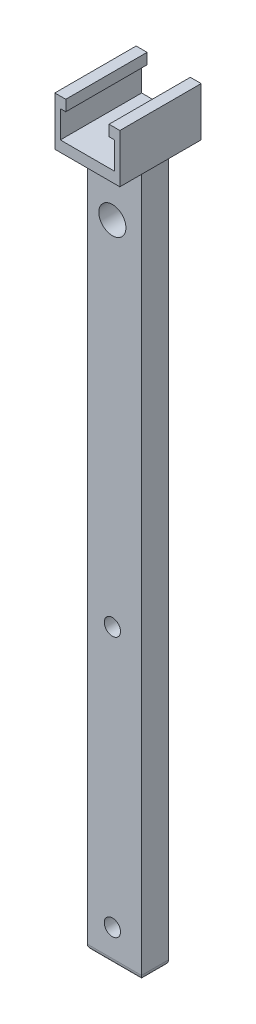
ISO-10303-21;
HEADER;
FILE_DESCRIPTION(('STEP AP214'),'2;1');
FILE_NAME('part.step','',(''),(''),'','','');
FILE_SCHEMA(('AUTOMOTIVE_DESIGN { 1 0 10303 214 1 1 1 1 }'));
ENDSEC;
DATA;
#1=APPLICATION_CONTEXT('core data for automotive mechanical design processes');
#2=APPLICATION_PROTOCOL_DEFINITION('international standard','automotive_design',2000,#1);
#3=PRODUCT_CONTEXT('',#1,'mechanical');
#4=PRODUCT('Part','Part','',(#3));
#5=PRODUCT_RELATED_PRODUCT_CATEGORY('part','',(#4));
#6=PRODUCT_DEFINITION_FORMATION('','',#4);
#7=PRODUCT_DEFINITION_CONTEXT('part definition',#1,'design');
#8=PRODUCT_DEFINITION('design','',#6,#7);
#9=PRODUCT_DEFINITION_SHAPE('','',#8);
#10=(LENGTH_UNIT() NAMED_UNIT(*) SI_UNIT(.MILLI.,.METRE.));
#11=(NAMED_UNIT(*) PLANE_ANGLE_UNIT() SI_UNIT($,.RADIAN.));
#12=(NAMED_UNIT(*) SI_UNIT($,.STERADIAN.) SOLID_ANGLE_UNIT());
#13=UNCERTAINTY_MEASURE_WITH_UNIT(LENGTH_MEASURE(1.E-05),#10,'distance_accuracy_value','');
#14=(GEOMETRIC_REPRESENTATION_CONTEXT(3) GLOBAL_UNCERTAINTY_ASSIGNED_CONTEXT((#13)) GLOBAL_UNIT_ASSIGNED_CONTEXT((#10,
#11,#12)) REPRESENTATION_CONTEXT('',''));
#15=CARTESIAN_POINT('',(0.,0.,0.));
#16=DIRECTION('',(0.,0.,1.));
#17=DIRECTION('',(1.,0.,0.));
#18=AXIS2_PLACEMENT_3D('',#15,#16,#17);
#19=CARTESIAN_POINT('',(-5.61885596488522,0.,15.));
#20=DIRECTION('',(0.,1.,0.));
#21=DIRECTION('',(0.,0.,1.));
#22=AXIS2_PLACEMENT_3D('',#19,#20,#21);
#23=PLANE('',#22);
#24=DIRECTION('',(-1.,0.,0.));
#25=VECTOR('',#24,1.);
#26=CARTESIAN_POINT('',(5.38114403511478,0.,11.));
#27=LINE('',#26,#25);
#28=CARTESIAN_POINT('',(-5.61885596488522,0.,11.));
#29=VERTEX_POINT('',#28);
#30=CARTESIAN_POINT('',(6.38114403511478,0.,11.));
#31=VERTEX_POINT('',#30);
#32=EDGE_CURVE('E207',#29,#31,#27,.F.);
#33=ORIENTED_EDGE('',*,*,#32,.T.);
#34=DIRECTION('',(0.,0.,-1.));
#35=VECTOR('',#34,1.);
#36=CARTESIAN_POINT('',(6.38114403511478,0.,15.));
#37=LINE('',#36,#35);
#38=CARTESIAN_POINT('',(6.38114403511478,0.,15.));
#39=VERTEX_POINT('',#38);
#40=EDGE_CURVE('E418',#39,#31,#37,.T.);
#41=ORIENTED_EDGE('',*,*,#40,.F.);
#42=DIRECTION('',(1.,0.,0.));
#43=VECTOR('',#42,1.);
#44=CARTESIAN_POINT('',(-5.61885596488522,0.,15.));
#45=LINE('',#44,#43);
#46=CARTESIAN_POINT('',(-5.61885596488522,0.,15.));
#47=VERTEX_POINT('',#46);
#48=EDGE_CURVE('E190',#47,#39,#45,.T.);
#49=ORIENTED_EDGE('',*,*,#48,.F.);
#50=DIRECTION('',(0.,0.,-1.));
#51=VECTOR('',#50,1.);
#52=CARTESIAN_POINT('',(-5.61885596488522,0.,15.));
#53=LINE('',#52,#51);
#54=EDGE_CURVE('E186',#47,#29,#53,.T.);
#55=ORIENTED_EDGE('',*,*,#54,.T.);
#56=EDGE_LOOP('',(#33,#41,#49,#55));
#57=FACE_BOUND('',#56,.T.);
#58=ADVANCED_FACE('F39',(#57),#23,.F.);
#59=CARTESIAN_POINT('',(6.38114403511478,0.,4.));
#60=VERTEX_POINT('',#59);
#61=CARTESIAN_POINT('',(6.38114403511478,0.,0.));
#62=VERTEX_POINT('',#61);
#63=EDGE_CURVE('E417',#60,#62,#37,.T.);
#64=ORIENTED_EDGE('',*,*,#63,.F.);
#65=DIRECTION('',(-1.,0.,0.));
#66=VECTOR('',#65,1.);
#67=CARTESIAN_POINT('',(-5.61885596488522,0.,4.));
#68=LINE('',#67,#66);
#69=CARTESIAN_POINT('',(-5.61885596488522,0.,4.));
#70=VERTEX_POINT('',#69);
#71=EDGE_CURVE('E225',#60,#70,#68,.T.);
#72=ORIENTED_EDGE('',*,*,#71,.T.);
#73=CARTESIAN_POINT('',(-5.61885596488522,0.,0.));
#74=VERTEX_POINT('',#73);
#75=EDGE_CURVE('E215',#70,#74,#53,.T.);
#76=ORIENTED_EDGE('',*,*,#75,.T.);
#77=DIRECTION('',(1.,0.,0.));
#78=VECTOR('',#77,1.);
#79=CARTESIAN_POINT('',(-5.61885596488522,0.,0.));
#80=LINE('',#79,#78);
#81=EDGE_CURVE('E354',#74,#62,#80,.T.);
#82=ORIENTED_EDGE('',*,*,#81,.T.);
#83=EDGE_LOOP('',(#64,#72,#76,#82));
#84=FACE_BOUND('',#83,.T.);
#85=ADVANCED_FACE('F437',(#84),#23,.F.);
#86=CARTESIAN_POINT('',(-3.60089189302894,9.,15.));
#87=DIRECTION('',(0.,-1.,0.));
#88=DIRECTION('',(0.,0.,-1.));
#89=AXIS2_PLACEMENT_3D('',#86,#87,#88);
#90=PLANE('',#89);
#91=DIRECTION('',(-1.,0.,0.));
#92=VECTOR('',#91,1.);
#93=CARTESIAN_POINT('',(-3.60089189302894,9.,0.));
#94=LINE('',#93,#92);
#95=CARTESIAN_POINT('',(-3.60089189302894,9.,0.));
#96=VERTEX_POINT('',#95);
#97=CARTESIAN_POINT('',(-5.61885596488522,9.,0.));
#98=VERTEX_POINT('',#97);
#99=EDGE_CURVE('E205',#96,#98,#94,.T.);
#100=ORIENTED_EDGE('',*,*,#99,.T.);
#101=DIRECTION('',(0.,0.,-1.));
#102=VECTOR('',#101,1.);
#103=CARTESIAN_POINT('',(-5.61885596488522,9.,15.));
#104=LINE('',#103,#102);
#105=CARTESIAN_POINT('',(-5.61885596488522,9.,15.));
#106=VERTEX_POINT('',#105);
#107=EDGE_CURVE('E182',#106,#98,#104,.T.);
#108=ORIENTED_EDGE('',*,*,#107,.F.);
#109=DIRECTION('',(-1.,0.,0.));
#110=VECTOR('',#109,1.);
#111=CARTESIAN_POINT('',(-3.60089189302894,9.,15.));
#112=LINE('',#111,#110);
#113=CARTESIAN_POINT('',(-3.60089189302894,9.,15.));
#114=VERTEX_POINT('',#113);
#115=EDGE_CURVE('E191',#114,#106,#112,.T.);
#116=ORIENTED_EDGE('',*,*,#115,.F.);
#117=DIRECTION('',(0.,0.,-1.));
#118=VECTOR('',#117,1.);
#119=CARTESIAN_POINT('',(-3.60089189302894,9.,15.));
#120=LINE('',#119,#118);
#121=EDGE_CURVE('E350',#114,#96,#120,.T.);
#122=ORIENTED_EDGE('',*,*,#121,.T.);
#123=EDGE_LOOP('',(#100,#108,#116,#122));
#124=FACE_BOUND('',#123,.T.);
#125=ADVANCED_FACE('F203',(#124),#90,.F.);
#126=CARTESIAN_POINT('',(-5.61885596488522,9.,15.));
#127=DIRECTION('',(1.,0.,0.));
#128=DIRECTION('',(0.,1.,0.));
#129=AXIS2_PLACEMENT_3D('',#126,#127,#128);
#130=PLANE('',#129);
#131=DIRECTION('',(0.,-1.,0.));
#132=VECTOR('',#131,1.);
#133=CARTESIAN_POINT('',(-5.61885596488522,9.,0.));
#134=LINE('',#133,#132);
#135=EDGE_CURVE('E317',#98,#74,#134,.T.);
#136=ORIENTED_EDGE('',*,*,#135,.T.);
#137=ORIENTED_EDGE('',*,*,#75,.F.);
#138=EDGE_CURVE('E213',#29,#70,#53,.T.);
#139=ORIENTED_EDGE('',*,*,#138,.F.);
#140=ORIENTED_EDGE('',*,*,#54,.F.);
#141=DIRECTION('',(0.,-1.,0.));
#142=VECTOR('',#141,1.);
#143=CARTESIAN_POINT('',(-5.61885596488522,9.,15.));
#144=LINE('',#143,#142);
#145=EDGE_CURVE('E177',#106,#47,#144,.T.);
#146=ORIENTED_EDGE('',*,*,#145,.F.);
#147=ORIENTED_EDGE('',*,*,#107,.T.);
#148=EDGE_LOOP('',(#136,#137,#139,#140,#146,#147));
#149=FACE_BOUND('',#148,.T.);
#150=ADVANCED_FACE('F180',(#149),#130,.F.);
#151=CARTESIAN_POINT('',(6.38114403511478,0.,15.));
#152=DIRECTION('',(-1.,0.,0.));
#153=DIRECTION('',(0.,0.,1.));
#154=AXIS2_PLACEMENT_3D('',#151,#152,#153);
#155=PLANE('',#154);
#156=DIRECTION('',(0.,1.,0.));
#157=VECTOR('',#156,1.);
#158=CARTESIAN_POINT('',(6.38114403511478,0.,0.));
#159=LINE('',#158,#157);
#160=CARTESIAN_POINT('',(6.38114403511478,9.,0.));
#161=VERTEX_POINT('',#160);
#162=EDGE_CURVE('E358',#62,#161,#159,.T.);
#163=ORIENTED_EDGE('',*,*,#162,.T.);
#164=DIRECTION('',(0.,0.,-1.));
#165=VECTOR('',#164,1.);
#166=CARTESIAN_POINT('',(6.38114403511478,9.,15.));
#167=LINE('',#166,#165);
#168=CARTESIAN_POINT('',(6.38114403511478,9.,15.));
#169=VERTEX_POINT('',#168);
#170=EDGE_CURVE('E414',#169,#161,#167,.T.);
#171=ORIENTED_EDGE('',*,*,#170,.F.);
#172=DIRECTION('',(0.,1.,0.));
#173=VECTOR('',#172,1.);
#174=CARTESIAN_POINT('',(6.38114403511478,0.,15.));
#175=LINE('',#174,#173);
#176=EDGE_CURVE('E325',#39,#169,#175,.T.);
#177=ORIENTED_EDGE('',*,*,#176,.F.);
#178=ORIENTED_EDGE('',*,*,#40,.T.);
#179=EDGE_CURVE('E421',#31,#60,#37,.T.);
#180=ORIENTED_EDGE('',*,*,#179,.T.);
#181=ORIENTED_EDGE('',*,*,#63,.T.);
#182=EDGE_LOOP('',(#163,#171,#177,#178,#180,#181));
#183=FACE_BOUND('',#182,.T.);
#184=ADVANCED_FACE('F431',(#183),#155,.F.);
#185=CARTESIAN_POINT('',(4.38114403511478,9.,15.));
#186=DIRECTION('',(0.,-1.,0.));
#187=DIRECTION('',(0.,0.,-1.));
#188=AXIS2_PLACEMENT_3D('',#185,#186,#187);
#189=PLANE('',#188);
#190=DIRECTION('',(-1.,0.,0.));
#191=VECTOR('',#190,1.);
#192=CARTESIAN_POINT('',(4.38114403511478,9.,0.));
#193=LINE('',#192,#191);
#194=CARTESIAN_POINT('',(4.38114403511478,9.,0.));
#195=VERTEX_POINT('',#194);
#196=EDGE_CURVE('E361',#161,#195,#193,.T.);
#197=ORIENTED_EDGE('',*,*,#196,.T.);
#198=DIRECTION('',(0.,0.,-1.));
#199=VECTOR('',#198,1.);
#200=CARTESIAN_POINT('',(4.38114403511478,9.,15.));
#201=LINE('',#200,#199);
#202=CARTESIAN_POINT('',(4.38114403511478,9.,15.));
#203=VERTEX_POINT('',#202);
#204=EDGE_CURVE('E410',#203,#195,#201,.T.);
#205=ORIENTED_EDGE('',*,*,#204,.F.);
#206=DIRECTION('',(-1.,0.,0.));
#207=VECTOR('',#206,1.);
#208=CARTESIAN_POINT('',(4.38114403511478,9.,15.));
#209=LINE('',#208,#207);
#210=EDGE_CURVE('E328',#169,#203,#209,.T.);
#211=ORIENTED_EDGE('',*,*,#210,.F.);
#212=ORIENTED_EDGE('',*,*,#170,.T.);
#213=EDGE_LOOP('',(#197,#205,#211,#212));
#214=FACE_BOUND('',#213,.T.);
#215=ADVANCED_FACE('F446',(#214),#189,.F.);
#216=CARTESIAN_POINT('',(4.38114403511478,9.,15.));
#217=DIRECTION('',(1.,0.,0.));
#218=DIRECTION('',(0.,0.,-1.));
#219=AXIS2_PLACEMENT_3D('',#216,#217,#218);
#220=PLANE('',#219);
#221=DIRECTION('',(0.,-1.,0.));
#222=VECTOR('',#221,1.);
#223=CARTESIAN_POINT('',(4.38114403511478,9.,0.));
#224=LINE('',#223,#222);
#225=CARTESIAN_POINT('',(4.38114403511478,7.,0.));
#226=VERTEX_POINT('',#225);
#227=EDGE_CURVE('E364',#195,#226,#224,.T.);
#228=ORIENTED_EDGE('',*,*,#227,.T.);
#229=DIRECTION('',(0.,0.,-1.));
#230=VECTOR('',#229,1.);
#231=CARTESIAN_POINT('',(4.38114403511478,7.,15.));
#232=LINE('',#231,#230);
#233=CARTESIAN_POINT('',(4.38114403511478,7.,15.));
#234=VERTEX_POINT('',#233);
#235=EDGE_CURVE('E406',#234,#226,#232,.T.);
#236=ORIENTED_EDGE('',*,*,#235,.F.);
#237=DIRECTION('',(0.,-1.,0.));
#238=VECTOR('',#237,1.);
#239=CARTESIAN_POINT('',(4.38114403511478,9.,15.));
#240=LINE('',#239,#238);
#241=EDGE_CURVE('E331',#203,#234,#240,.T.);
#242=ORIENTED_EDGE('',*,*,#241,.F.);
#243=ORIENTED_EDGE('',*,*,#204,.T.);
#244=EDGE_LOOP('',(#228,#236,#242,#243));
#245=FACE_BOUND('',#244,.T.);
#246=ADVANCED_FACE('F450',(#245),#220,.F.);
#247=CARTESIAN_POINT('',(4.38114403511478,7.,15.));
#248=DIRECTION('',(0.,1.,0.));
#249=DIRECTION('',(0.,0.,1.));
#250=AXIS2_PLACEMENT_3D('',#247,#248,#249);
#251=PLANE('',#250);
#252=DIRECTION('',(1.,0.,0.));
#253=VECTOR('',#252,1.);
#254=CARTESIAN_POINT('',(4.38114403511478,7.,0.));
#255=LINE('',#254,#253);
#256=CARTESIAN_POINT('',(5.39910810697106,7.,0.));
#257=VERTEX_POINT('',#256);
#258=EDGE_CURVE('E367',#226,#257,#255,.T.);
#259=ORIENTED_EDGE('',*,*,#258,.T.);
#260=DIRECTION('',(0.,0.,-1.));
#261=VECTOR('',#260,1.);
#262=CARTESIAN_POINT('',(5.39910810697106,7.,15.));
#263=LINE('',#262,#261);
#264=CARTESIAN_POINT('',(5.39910810697106,7.,15.));
#265=VERTEX_POINT('',#264);
#266=EDGE_CURVE('E402',#265,#257,#263,.T.);
#267=ORIENTED_EDGE('',*,*,#266,.F.);
#268=DIRECTION('',(1.,0.,0.));
#269=VECTOR('',#268,1.);
#270=CARTESIAN_POINT('',(4.38114403511478,7.,15.));
#271=LINE('',#270,#269);
#272=EDGE_CURVE('E334',#234,#265,#271,.T.);
#273=ORIENTED_EDGE('',*,*,#272,.F.);
#274=ORIENTED_EDGE('',*,*,#235,.T.);
#275=EDGE_LOOP('',(#259,#267,#273,#274));
#276=FACE_BOUND('',#275,.T.);
#277=ADVANCED_FACE('F497',(#276),#251,.F.);
#278=CARTESIAN_POINT('',(5.39910810697106,7.,15.));
#279=DIRECTION('',(1.,0.,0.));
#280=DIRECTION('',(0.,0.,-1.));
#281=AXIS2_PLACEMENT_3D('',#278,#279,#280);
#282=PLANE('',#281);
#283=DIRECTION('',(0.,-1.,0.));
#284=VECTOR('',#283,1.);
#285=CARTESIAN_POINT('',(5.39910810697106,7.,0.));
#286=LINE('',#285,#284);
#287=CARTESIAN_POINT('',(5.39910810697106,2.,0.));
#288=VERTEX_POINT('',#287);
#289=EDGE_CURVE('E370',#257,#288,#286,.T.);
#290=ORIENTED_EDGE('',*,*,#289,.T.);
#291=DIRECTION('',(0.,0.,-1.));
#292=VECTOR('',#291,1.);
#293=CARTESIAN_POINT('',(5.39910810697106,2.,15.));
#294=LINE('',#293,#292);
#295=CARTESIAN_POINT('',(5.39910810697106,2.,15.));
#296=VERTEX_POINT('',#295);
#297=EDGE_CURVE('E398',#296,#288,#294,.T.);
#298=ORIENTED_EDGE('',*,*,#297,.F.);
#299=DIRECTION('',(0.,-1.,0.));
#300=VECTOR('',#299,1.);
#301=CARTESIAN_POINT('',(5.39910810697106,7.,15.));
#302=LINE('',#301,#300);
#303=EDGE_CURVE('E337',#265,#296,#302,.T.);
#304=ORIENTED_EDGE('',*,*,#303,.F.);
#305=ORIENTED_EDGE('',*,*,#266,.T.);
#306=EDGE_LOOP('',(#290,#298,#304,#305));
#307=FACE_BOUND('',#306,.T.);
#308=ADVANCED_FACE('F495',(#307),#282,.F.);
#309=CARTESIAN_POINT('',(5.39910810697106,2.,15.));
#310=DIRECTION('',(0.,-1.,0.));
#311=DIRECTION('',(1.,0.,0.));
#312=AXIS2_PLACEMENT_3D('',#309,#310,#311);
#313=PLANE('',#312);
#314=DIRECTION('',(-1.,0.,0.));
#315=VECTOR('',#314,1.);
#316=CARTESIAN_POINT('',(5.39910810697106,2.,0.));
#317=LINE('',#316,#315);
#318=CARTESIAN_POINT('',(-4.60089189302894,2.,0.));
#319=VERTEX_POINT('',#318);
#320=EDGE_CURVE('E373',#288,#319,#317,.T.);
#321=ORIENTED_EDGE('',*,*,#320,.T.);
#322=DIRECTION('',(0.,0.,-1.));
#323=VECTOR('',#322,1.);
#324=CARTESIAN_POINT('',(-4.60089189302894,2.,15.));
#325=LINE('',#324,#323);
#326=CARTESIAN_POINT('',(-4.60089189302894,2.,15.));
#327=VERTEX_POINT('',#326);
#328=EDGE_CURVE('E394',#327,#319,#325,.T.);
#329=ORIENTED_EDGE('',*,*,#328,.F.);
#330=DIRECTION('',(-1.,0.,0.));
#331=VECTOR('',#330,1.);
#332=CARTESIAN_POINT('',(5.39910810697106,2.,15.));
#333=LINE('',#332,#331);
#334=EDGE_CURVE('E340',#296,#327,#333,.T.);
#335=ORIENTED_EDGE('',*,*,#334,.F.);
#336=ORIENTED_EDGE('',*,*,#297,.T.);
#337=EDGE_LOOP('',(#321,#329,#335,#336));
#338=FACE_BOUND('',#337,.T.);
#339=ADVANCED_FACE('F490',(#338),#313,.F.);
#340=CARTESIAN_POINT('',(-4.60089189302894,2.,15.));
#341=DIRECTION('',(-1.,0.,0.));
#342=DIRECTION('',(0.,-1.,0.));
#343=AXIS2_PLACEMENT_3D('',#340,#341,#342);
#344=PLANE('',#343);
#345=DIRECTION('',(0.,1.,0.));
#346=VECTOR('',#345,1.);
#347=CARTESIAN_POINT('',(-4.60089189302894,2.,0.));
#348=LINE('',#347,#346);
#349=CARTESIAN_POINT('',(-4.60089189302894,7.,0.));
#350=VERTEX_POINT('',#349);
#351=EDGE_CURVE('E376',#319,#350,#348,.T.);
#352=ORIENTED_EDGE('',*,*,#351,.T.);
#353=DIRECTION('',(0.,0.,-1.));
#354=VECTOR('',#353,1.);
#355=CARTESIAN_POINT('',(-4.60089189302894,7.,15.));
#356=LINE('',#355,#354);
#357=CARTESIAN_POINT('',(-4.60089189302894,7.,15.));
#358=VERTEX_POINT('',#357);
#359=EDGE_CURVE('E390',#358,#350,#356,.T.);
#360=ORIENTED_EDGE('',*,*,#359,.F.);
#361=DIRECTION('',(0.,1.,0.));
#362=VECTOR('',#361,1.);
#363=CARTESIAN_POINT('',(-4.60089189302894,2.,15.));
#364=LINE('',#363,#362);
#365=EDGE_CURVE('E343',#327,#358,#364,.T.);
#366=ORIENTED_EDGE('',*,*,#365,.F.);
#367=ORIENTED_EDGE('',*,*,#328,.T.);
#368=EDGE_LOOP('',(#352,#360,#366,#367));
#369=FACE_BOUND('',#368,.T.);
#370=ADVANCED_FACE('F485',(#369),#344,.F.);
#371=CARTESIAN_POINT('',(-4.60089189302894,7.,15.));
#372=DIRECTION('',(0.,1.,0.));
#373=DIRECTION('',(0.,0.,1.));
#374=AXIS2_PLACEMENT_3D('',#371,#372,#373);
#375=PLANE('',#374);
#376=DIRECTION('',(1.,0.,0.));
#377=VECTOR('',#376,1.);
#378=CARTESIAN_POINT('',(-4.60089189302894,7.,0.));
#379=LINE('',#378,#377);
#380=CARTESIAN_POINT('',(-3.60089189302894,7.,0.));
#381=VERTEX_POINT('',#380);
#382=EDGE_CURVE('E379',#350,#381,#379,.T.);
#383=ORIENTED_EDGE('',*,*,#382,.T.);
#384=DIRECTION('',(0.,0.,-1.));
#385=VECTOR('',#384,1.);
#386=CARTESIAN_POINT('',(-3.60089189302894,7.,15.));
#387=LINE('',#386,#385);
#388=CARTESIAN_POINT('',(-3.60089189302894,7.,15.));
#389=VERTEX_POINT('',#388);
#390=EDGE_CURVE('E386',#389,#381,#387,.T.);
#391=ORIENTED_EDGE('',*,*,#390,.F.);
#392=DIRECTION('',(1.,0.,0.));
#393=VECTOR('',#392,1.);
#394=CARTESIAN_POINT('',(-4.60089189302894,7.,15.));
#395=LINE('',#394,#393);
#396=EDGE_CURVE('E346',#358,#389,#395,.T.);
#397=ORIENTED_EDGE('',*,*,#396,.F.);
#398=ORIENTED_EDGE('',*,*,#359,.T.);
#399=EDGE_LOOP('',(#383,#391,#397,#398));
#400=FACE_BOUND('',#399,.T.);
#401=ADVANCED_FACE('F481',(#400),#375,.F.);
#402=CARTESIAN_POINT('',(-3.60089189302894,7.,15.));
#403=DIRECTION('',(-1.,0.,0.));
#404=DIRECTION('',(0.,0.,1.));
#405=AXIS2_PLACEMENT_3D('',#402,#403,#404);
#406=PLANE('',#405);
#407=DIRECTION('',(0.,1.,0.));
#408=VECTOR('',#407,1.);
#409=CARTESIAN_POINT('',(-3.60089189302894,7.,0.));
#410=LINE('',#409,#408);
#411=EDGE_CURVE('E201',#381,#96,#410,.T.);
#412=ORIENTED_EDGE('',*,*,#411,.T.);
#413=ORIENTED_EDGE('',*,*,#121,.F.);
#414=DIRECTION('',(0.,1.,0.));
#415=VECTOR('',#414,1.);
#416=CARTESIAN_POINT('',(-3.60089189302894,7.,15.));
#417=LINE('',#416,#415);
#418=EDGE_CURVE('E196',#389,#114,#417,.T.);
#419=ORIENTED_EDGE('',*,*,#418,.F.);
#420=ORIENTED_EDGE('',*,*,#390,.T.);
#421=EDGE_LOOP('',(#412,#413,#419,#420));
#422=FACE_BOUND('',#421,.T.);
#423=ADVANCED_FACE('F477',(#422),#406,.F.);
#424=CARTESIAN_POINT('',(0.,0.,15.));
#425=DIRECTION('',(0.,0.,1.));
#426=DIRECTION('',(1.,0.,0.));
#427=AXIS2_PLACEMENT_3D('',#424,#425,#426);
#428=PLANE('',#427);
#429=ORIENTED_EDGE('',*,*,#115,.T.);
#430=ORIENTED_EDGE('',*,*,#145,.T.);
#431=ORIENTED_EDGE('',*,*,#48,.T.);
#432=ORIENTED_EDGE('',*,*,#176,.T.);
#433=ORIENTED_EDGE('',*,*,#210,.T.);
#434=ORIENTED_EDGE('',*,*,#241,.T.);
#435=ORIENTED_EDGE('',*,*,#272,.T.);
#436=ORIENTED_EDGE('',*,*,#303,.T.);
#437=ORIENTED_EDGE('',*,*,#334,.T.);
#438=ORIENTED_EDGE('',*,*,#365,.T.);
#439=ORIENTED_EDGE('',*,*,#396,.T.);
#440=ORIENTED_EDGE('',*,*,#418,.T.);
#441=EDGE_LOOP('',(#429,#430,#431,#432,#433,#434,#435,#436,#437,#438,#439,#440));
#442=FACE_BOUND('',#441,.T.);
#443=ADVANCED_FACE('F194',(#442),#428,.T.);
#444=CARTESIAN_POINT('',(0.,0.,0.));
#445=DIRECTION('',(0.,0.,1.));
#446=DIRECTION('',(1.,0.,0.));
#447=AXIS2_PLACEMENT_3D('',#444,#445,#446);
#448=PLANE('',#447);
#449=ORIENTED_EDGE('',*,*,#99,.F.);
#450=ORIENTED_EDGE('',*,*,#411,.F.);
#451=ORIENTED_EDGE('',*,*,#382,.F.);
#452=ORIENTED_EDGE('',*,*,#351,.F.);
#453=ORIENTED_EDGE('',*,*,#320,.F.);
#454=ORIENTED_EDGE('',*,*,#289,.F.);
#455=ORIENTED_EDGE('',*,*,#258,.F.);
#456=ORIENTED_EDGE('',*,*,#227,.F.);
#457=ORIENTED_EDGE('',*,*,#196,.F.);
#458=ORIENTED_EDGE('',*,*,#162,.F.);
#459=ORIENTED_EDGE('',*,*,#81,.F.);
#460=ORIENTED_EDGE('',*,*,#135,.F.);
#461=EDGE_LOOP('',(#449,#450,#451,#452,#453,#454,#455,#456,#457,#458,#459,#460));
#462=FACE_BOUND('',#461,.T.);
#463=ADVANCED_FACE('F441',(#462),#448,.F.);
#464=CARTESIAN_POINT('',(5.38114403511478,-130.,10.));
#465=DIRECTION('',(0.,0.,-1.));
#466=DIRECTION('',(-1.,0.,0.));
#467=AXIS2_PLACEMENT_3D('',#464,#465,#466);
#468=PLANE('',#467);
#469=CARTESIAN_POINT('',(0.,-11.,10.));
#470=DIRECTION('',(0.,0.,-1.));
#471=DIRECTION('',(-1.,0.,0.));
#472=AXIS2_PLACEMENT_3D('',#469,#470,#471);
#473=CIRCLE('',#472,2.5);
#474=CARTESIAN_POINT('',(-2.5,-11.,10.));
#475=VERTEX_POINT('',#474);
#476=EDGE_CURVE('E279',#475,#475,#473,.F.);
#477=ORIENTED_EDGE('',*,*,#476,.F.);
#478=EDGE_LOOP('',(#477));
#479=FACE_BOUND('',#478,.T.);
#480=CARTESIAN_POINT('',(0.,-124.,10.));
#481=DIRECTION('',(0.,0.,-1.));
#482=DIRECTION('',(-1.,0.,0.));
#483=AXIS2_PLACEMENT_3D('',#480,#481,#482);
#484=CIRCLE('',#483,1.5);
#485=CARTESIAN_POINT('',(-1.5,-124.,10.));
#486=VERTEX_POINT('',#485);
#487=EDGE_CURVE('E732',#486,#486,#484,.F.);
#488=ORIENTED_EDGE('',*,*,#487,.F.);
#489=EDGE_LOOP('',(#488));
#490=FACE_BOUND('',#489,.T.);
#491=CARTESIAN_POINT('',(0.,-76.,10.));
#492=DIRECTION('',(0.,0.,-1.));
#493=DIRECTION('',(-1.,0.,0.));
#494=AXIS2_PLACEMENT_3D('',#491,#492,#493);
#495=CIRCLE('',#494,1.5);
#496=CARTESIAN_POINT('',(-1.5,-76.,10.));
#497=VERTEX_POINT('',#496);
#498=EDGE_CURVE('E739',#497,#497,#495,.F.);
#499=ORIENTED_EDGE('',*,*,#498,.F.);
#500=EDGE_LOOP('',(#499));
#501=FACE_BOUND('',#500,.T.);
#502=DIRECTION('',(0.,1.,0.));
#503=VECTOR('',#502,1.);
#504=CARTESIAN_POINT('',(-4.61885596488522,-130.,10.));
#505=LINE('',#504,#503);
#506=CARTESIAN_POINT('',(-4.61885596488522,-129.,10.));
#507=VERTEX_POINT('',#506);
#508=CARTESIAN_POINT('',(-4.61885596488522,-1.,10.));
#509=VERTEX_POINT('',#508);
#510=EDGE_CURVE('E308',#507,#509,#505,.T.);
#511=ORIENTED_EDGE('',*,*,#510,.F.);
#512=DIRECTION('',(-1.,0.,0.));
#513=VECTOR('',#512,1.);
#514=CARTESIAN_POINT('',(5.38114403511478,-129.,10.));
#515=LINE('',#514,#513);
#516=CARTESIAN_POINT('',(5.38114403511478,-129.,10.));
#517=VERTEX_POINT('',#516);
#518=EDGE_CURVE('E11',#507,#517,#515,.F.);
#519=ORIENTED_EDGE('',*,*,#518,.T.);
#520=DIRECTION('',(0.,1.,0.));
#521=VECTOR('',#520,1.);
#522=CARTESIAN_POINT('',(5.38114403511478,-130.,10.));
#523=LINE('',#522,#521);
#524=CARTESIAN_POINT('',(5.38114403511478,-1.,10.));
#525=VERTEX_POINT('',#524);
#526=EDGE_CURVE('E229',#517,#525,#523,.T.);
#527=ORIENTED_EDGE('',*,*,#526,.T.);
#528=DIRECTION('',(-1.,0.,0.));
#529=VECTOR('',#528,1.);
#530=CARTESIAN_POINT('',(-4.61885596488522,-1.,10.));
#531=LINE('',#530,#529);
#532=EDGE_CURVE('E221',#525,#509,#531,.T.);
#533=ORIENTED_EDGE('',*,*,#532,.T.);
#534=EDGE_LOOP('',(#511,#519,#527,#533));
#535=FACE_BOUND('',#534,.T.);
#536=ADVANCED_FACE('F310',(#479,#490,#501,#535),#468,.F.);
#537=CARTESIAN_POINT('',(-4.61885596488522,-130.,5.));
#538=DIRECTION('',(-1.,0.,0.));
#539=DIRECTION('',(0.,0.,1.));
#540=AXIS2_PLACEMENT_3D('',#537,#538,#539);
#541=PLANE('',#540);
#542=DIRECTION('',(0.,1.,0.));
#543=VECTOR('',#542,1.);
#544=CARTESIAN_POINT('',(-4.61885596488522,-130.,5.));
#545=LINE('',#544,#543);
#546=CARTESIAN_POINT('',(-4.61885596488522,-129.,5.));
#547=VERTEX_POINT('',#546);
#548=CARTESIAN_POINT('',(-4.61885596488522,-1.,5.));
#549=VERTEX_POINT('',#548);
#550=EDGE_CURVE('E309',#547,#549,#545,.T.);
#551=ORIENTED_EDGE('',*,*,#550,.F.);
#552=DIRECTION('',(0.,0.,1.));
#553=VECTOR('',#552,1.);
#554=CARTESIAN_POINT('',(-4.61885596488522,-129.,10.));
#555=LINE('',#554,#553);
#556=EDGE_CURVE('E253',#547,#507,#555,.T.);
#557=ORIENTED_EDGE('',*,*,#556,.T.);
#558=ORIENTED_EDGE('',*,*,#510,.T.);
#559=DIRECTION('',(0.,0.,1.));
#560=VECTOR('',#559,1.);
#561=CARTESIAN_POINT('',(-4.61885596488522,-1.,5.));
#562=LINE('',#561,#560);
#563=EDGE_CURVE('E211',#509,#549,#562,.F.);
#564=ORIENTED_EDGE('',*,*,#563,.T.);
#565=EDGE_LOOP('',(#551,#557,#558,#564));
#566=FACE_BOUND('',#565,.T.);
#567=ADVANCED_FACE('F307',(#566),#541,.T.);
#568=CARTESIAN_POINT('',(5.38114403511478,-130.,5.));
#569=DIRECTION('',(0.,0.,-1.));
#570=DIRECTION('',(-1.,0.,0.));
#571=AXIS2_PLACEMENT_3D('',#568,#569,#570);
#572=PLANE('',#571);
#573=CARTESIAN_POINT('',(0.,-11.,5.));
#574=DIRECTION('',(0.,0.,-1.));
#575=DIRECTION('',(-1.,0.,0.));
#576=AXIS2_PLACEMENT_3D('',#573,#574,#575);
#577=CIRCLE('',#576,2.5);
#578=CARTESIAN_POINT('',(-2.5,-11.,5.));
#579=VERTEX_POINT('',#578);
#580=EDGE_CURVE('E726',#579,#579,#577,.T.);
#581=ORIENTED_EDGE('',*,*,#580,.F.);
#582=EDGE_LOOP('',(#581));
#583=FACE_BOUND('',#582,.T.);
#584=CARTESIAN_POINT('',(0.,-124.,5.));
#585=DIRECTION('',(0.,0.,-1.));
#586=DIRECTION('',(-1.,0.,0.));
#587=AXIS2_PLACEMENT_3D('',#584,#585,#586);
#588=CIRCLE('',#587,1.5);
#589=CARTESIAN_POINT('',(-1.5,-124.,5.));
#590=VERTEX_POINT('',#589);
#591=EDGE_CURVE('E735',#590,#590,#588,.T.);
#592=ORIENTED_EDGE('',*,*,#591,.F.);
#593=EDGE_LOOP('',(#592));
#594=FACE_BOUND('',#593,.T.);
#595=CARTESIAN_POINT('',(0.,-76.,5.));
#596=DIRECTION('',(0.,0.,-1.));
#597=DIRECTION('',(-1.,0.,0.));
#598=AXIS2_PLACEMENT_3D('',#595,#596,#597);
#599=CIRCLE('',#598,1.5);
#600=CARTESIAN_POINT('',(-1.5,-76.,5.));
#601=VERTEX_POINT('',#600);
#602=EDGE_CURVE('E743',#601,#601,#599,.T.);
#603=ORIENTED_EDGE('',*,*,#602,.F.);
#604=EDGE_LOOP('',(#603));
#605=FACE_BOUND('',#604,.T.);
#606=DIRECTION('',(0.,1.,0.));
#607=VECTOR('',#606,1.);
#608=CARTESIAN_POINT('',(5.38114403511478,-130.,5.));
#609=LINE('',#608,#607);
#610=CARTESIAN_POINT('',(5.38114403511478,-129.,5.));
#611=VERTEX_POINT('',#610);
#612=CARTESIAN_POINT('',(5.38114403511478,-1.,5.));
#613=VERTEX_POINT('',#612);
#614=EDGE_CURVE('E319',#611,#613,#609,.T.);
#615=ORIENTED_EDGE('',*,*,#614,.F.);
#616=DIRECTION('',(-1.,0.,0.));
#617=VECTOR('',#616,1.);
#618=CARTESIAN_POINT('',(-4.61885596488522,-129.,5.));
#619=LINE('',#618,#617);
#620=EDGE_CURVE('E270',#611,#547,#619,.T.);
#621=ORIENTED_EDGE('',*,*,#620,.T.);
#622=ORIENTED_EDGE('',*,*,#550,.T.);
#623=DIRECTION('',(-1.,0.,0.));
#624=VECTOR('',#623,1.);
#625=CARTESIAN_POINT('',(5.38114403511478,-1.,5.));
#626=LINE('',#625,#624);
#627=EDGE_CURVE('E233',#549,#613,#626,.F.);
#628=ORIENTED_EDGE('',*,*,#627,.T.);
#629=EDGE_LOOP('',(#615,#621,#622,#628));
#630=FACE_BOUND('',#629,.T.);
#631=ADVANCED_FACE('F470',(#583,#594,#605,#630),#572,.T.);
#632=CARTESIAN_POINT('',(5.38114403511478,-130.,5.));
#633=DIRECTION('',(-1.,0.,0.));
#634=DIRECTION('',(0.,0.,1.));
#635=AXIS2_PLACEMENT_3D('',#632,#633,#634);
#636=PLANE('',#635);
#637=ORIENTED_EDGE('',*,*,#526,.F.);
#638=DIRECTION('',(0.,0.,1.));
#639=VECTOR('',#638,1.);
#640=CARTESIAN_POINT('',(5.38114403511478,-129.,5.));
#641=LINE('',#640,#639);
#642=EDGE_CURVE('E49',#517,#611,#641,.F.);
#643=ORIENTED_EDGE('',*,*,#642,.T.);
#644=ORIENTED_EDGE('',*,*,#614,.T.);
#645=DIRECTION('',(0.,0.,1.));
#646=VECTOR('',#645,1.);
#647=CARTESIAN_POINT('',(5.38114403511478,-1.,11.));
#648=LINE('',#647,#646);
#649=EDGE_CURVE('E241',#613,#525,#648,.T.);
#650=ORIENTED_EDGE('',*,*,#649,.T.);
#651=EDGE_LOOP('',(#637,#643,#644,#650));
#652=FACE_BOUND('',#651,.T.);
#653=ADVANCED_FACE('F463',(#652),#636,.F.);
#654=CARTESIAN_POINT('',(0.,-130.,0.));
#655=DIRECTION('',(0.,1.,0.));
#656=DIRECTION('',(0.,0.,1.));
#657=AXIS2_PLACEMENT_3D('',#654,#655,#656);
#658=PLANE('',#657);
#659=DIRECTION('',(-1.,0.,0.));
#660=VECTOR('',#659,1.);
#661=CARTESIAN_POINT('',(0.,-130.,9.));
#662=LINE('',#661,#660);
#663=CARTESIAN_POINT('',(4.38114403511478,-130.,9.));
#664=VERTEX_POINT('',#663);
#665=CARTESIAN_POINT('',(-3.61885596488522,-130.,9.));
#666=VERTEX_POINT('',#665);
#667=EDGE_CURVE('E257',#664,#666,#662,.T.);
#668=ORIENTED_EDGE('',*,*,#667,.T.);
#669=DIRECTION('',(0.,0.,1.));
#670=VECTOR('',#669,1.);
#671=CARTESIAN_POINT('',(-3.61885596488522,-130.,5.));
#672=LINE('',#671,#670);
#673=CARTESIAN_POINT('',(-3.61885596488522,-130.,6.));
#674=VERTEX_POINT('',#673);
#675=EDGE_CURVE('E266',#666,#674,#672,.F.);
#676=ORIENTED_EDGE('',*,*,#675,.T.);
#677=DIRECTION('',(-1.,0.,0.));
#678=VECTOR('',#677,1.);
#679=CARTESIAN_POINT('',(5.38114403511478,-130.,6.));
#680=LINE('',#679,#678);
#681=CARTESIAN_POINT('',(4.38114403511478,-130.,6.));
#682=VERTEX_POINT('',#681);
#683=EDGE_CURVE('E263',#674,#682,#680,.F.);
#684=ORIENTED_EDGE('',*,*,#683,.T.);
#685=DIRECTION('',(0.,0.,1.));
#686=VECTOR('',#685,1.);
#687=CARTESIAN_POINT('',(4.38114403511478,-130.,0.));
#688=LINE('',#687,#686);
#689=EDGE_CURVE('E260',#682,#664,#688,.T.);
#690=ORIENTED_EDGE('',*,*,#689,.T.);
#691=EDGE_LOOP('',(#668,#676,#684,#690));
#692=FACE_BOUND('',#691,.T.);
#693=ADVANCED_FACE('F298',(#692),#658,.F.);
#694=CARTESIAN_POINT('',(5.38114403511478,-1.,11.));
#695=DIRECTION('',(1.,0.,0.));
#696=DIRECTION('',(0.,0.,-1.));
#697=AXIS2_PLACEMENT_3D('',#694,#695,#696);
#698=CYLINDRICAL_SURFACE('',#697,1.);
#699=ORIENTED_EDGE('',*,*,#532,.F.);
#700=CARTESIAN_POINT('',(6.38114403511478,-1.,11.));
#701=DIRECTION('',(0.707106781186547,0.,-0.707106781186547));
#702=DIRECTION('',(0.707106781186547,0.,0.707106781186547));
#703=AXIS2_PLACEMENT_3D('',#700,#701,#702);
#704=ELLIPSE('',#703,1.41421356237309,1.);
#705=EDGE_CURVE('E245',#525,#31,#704,.T.);
#706=ORIENTED_EDGE('',*,*,#705,.T.);
#707=ORIENTED_EDGE('',*,*,#32,.F.);
#708=CARTESIAN_POINT('',(-5.61885596488522,-1.,11.));
#709=DIRECTION('',(0.707106781186548,0.,0.707106781186547));
#710=DIRECTION('',(0.707106781186547,0.,-0.707106781186548));
#711=AXIS2_PLACEMENT_3D('',#708,#709,#710);
#712=ELLIPSE('',#711,1.41421356237309,1.);
#713=EDGE_CURVE('E226',#509,#29,#712,.T.);
#714=ORIENTED_EDGE('',*,*,#713,.F.);
#715=EDGE_LOOP('',(#699,#706,#707,#714));
#716=FACE_BOUND('',#715,.T.);
#717=ADVANCED_FACE('F459',(#716),#698,.F.);
#718=CARTESIAN_POINT('',(-5.61885596488522,-1.,15.));
#719=DIRECTION('',(0.,0.,1.));
#720=DIRECTION('',(1.,0.,0.));
#721=AXIS2_PLACEMENT_3D('',#718,#719,#720);
#722=CYLINDRICAL_SURFACE('',#721,1.);
#723=ORIENTED_EDGE('',*,*,#138,.T.);
#724=CARTESIAN_POINT('',(-5.61885596488522,-1.,4.));
#725=DIRECTION('',(-0.707106781186547,0.,0.707106781186547));
#726=DIRECTION('',(0.707106781186548,0.,0.707106781186547));
#727=AXIS2_PLACEMENT_3D('',#724,#725,#726);
#728=ELLIPSE('',#727,1.4142135623731,1.);
#729=EDGE_CURVE('E237',#70,#549,#728,.F.);
#730=ORIENTED_EDGE('',*,*,#729,.T.);
#731=ORIENTED_EDGE('',*,*,#563,.F.);
#732=ORIENTED_EDGE('',*,*,#713,.T.);
#733=EDGE_LOOP('',(#723,#730,#731,#732));
#734=FACE_BOUND('',#733,.T.);
#735=ADVANCED_FACE('F472',(#734),#722,.F.);
#736=CARTESIAN_POINT('',(-5.61885596488522,-1.,4.));
#737=DIRECTION('',(-1.,0.,0.));
#738=DIRECTION('',(0.,0.,1.));
#739=AXIS2_PLACEMENT_3D('',#736,#737,#738);
#740=CYLINDRICAL_SURFACE('',#739,1.);
#741=ORIENTED_EDGE('',*,*,#71,.F.);
#742=CARTESIAN_POINT('',(6.38114403511478,-1.,4.));
#743=DIRECTION('',(-0.707106781186547,0.,-0.707106781186547));
#744=DIRECTION('',(-0.707106781186548,0.,0.707106781186547));
#745=AXIS2_PLACEMENT_3D('',#742,#743,#744);
#746=ELLIPSE('',#745,1.41421356237309,1.);
#747=EDGE_CURVE('E249',#60,#613,#746,.F.);
#748=ORIENTED_EDGE('',*,*,#747,.T.);
#749=ORIENTED_EDGE('',*,*,#627,.F.);
#750=ORIENTED_EDGE('',*,*,#729,.F.);
#751=EDGE_LOOP('',(#741,#748,#749,#750));
#752=FACE_BOUND('',#751,.T.);
#753=ADVANCED_FACE('F468',(#752),#740,.F.);
#754=CARTESIAN_POINT('',(6.38114403511478,-1.,5.));
#755=DIRECTION('',(0.,0.,-1.));
#756=DIRECTION('',(-1.,0.,0.));
#757=AXIS2_PLACEMENT_3D('',#754,#755,#756);
#758=CYLINDRICAL_SURFACE('',#757,1.);
#759=ORIENTED_EDGE('',*,*,#747,.F.);
#760=ORIENTED_EDGE('',*,*,#179,.F.);
#761=ORIENTED_EDGE('',*,*,#705,.F.);
#762=ORIENTED_EDGE('',*,*,#649,.F.);
#763=EDGE_LOOP('',(#759,#760,#761,#762));
#764=FACE_BOUND('',#763,.T.);
#765=ADVANCED_FACE('F462',(#764),#758,.F.);
#766=CARTESIAN_POINT('',(4.38114403511478,-129.,0.));
#767=DIRECTION('',(0.,0.,1.));
#768=DIRECTION('',(1.,0.,0.));
#769=AXIS2_PLACEMENT_3D('',#766,#767,#768);
#770=CYLINDRICAL_SURFACE('',#769,1.);
#771=CARTESIAN_POINT('',(4.38114403511478,-129.,9.));
#772=DIRECTION('',(-0.707106781186547,0.,0.707106781186547));
#773=DIRECTION('',(-0.707106781186547,0.,-0.707106781186547));
#774=AXIS2_PLACEMENT_3D('',#771,#772,#773);
#775=ELLIPSE('',#774,1.41421356237309,1.);
#776=EDGE_CURVE('E281',#664,#517,#775,.T.);
#777=ORIENTED_EDGE('',*,*,#776,.F.);
#778=ORIENTED_EDGE('',*,*,#689,.F.);
#779=CARTESIAN_POINT('',(4.38114403511478,-129.,6.));
#780=DIRECTION('',(0.707106781186547,0.,0.707106781186547));
#781=DIRECTION('',(-0.707106781186548,0.,0.707106781186547));
#782=AXIS2_PLACEMENT_3D('',#779,#780,#781);
#783=ELLIPSE('',#782,1.41421356237309,1.);
#784=EDGE_CURVE('E43',#611,#682,#783,.F.);
#785=ORIENTED_EDGE('',*,*,#784,.F.);
#786=ORIENTED_EDGE('',*,*,#642,.F.);
#787=EDGE_LOOP('',(#777,#778,#785,#786));
#788=FACE_BOUND('',#787,.T.);
#789=ADVANCED_FACE('F41',(#788),#770,.T.);
#790=CARTESIAN_POINT('',(5.38114403511478,-129.,6.));
#791=DIRECTION('',(1.,0.,0.));
#792=DIRECTION('',(0.,0.,-1.));
#793=AXIS2_PLACEMENT_3D('',#790,#791,#792);
#794=CYLINDRICAL_SURFACE('',#793,1.);
#795=ORIENTED_EDGE('',*,*,#784,.T.);
#796=ORIENTED_EDGE('',*,*,#683,.F.);
#797=CARTESIAN_POINT('',(-3.61885596488522,-129.,6.));
#798=DIRECTION('',(0.707106781186547,0.,-0.707106781186547));
#799=DIRECTION('',(0.707106781186548,0.,0.707106781186547));
#800=AXIS2_PLACEMENT_3D('',#797,#798,#799);
#801=ELLIPSE('',#800,1.4142135623731,1.);
#802=EDGE_CURVE('E278',#547,#674,#801,.F.);
#803=ORIENTED_EDGE('',*,*,#802,.F.);
#804=ORIENTED_EDGE('',*,*,#620,.F.);
#805=EDGE_LOOP('',(#795,#796,#803,#804));
#806=FACE_BOUND('',#805,.T.);
#807=ADVANCED_FACE('F293',(#806),#794,.T.);
#808=CARTESIAN_POINT('',(0.,-129.,9.));
#809=DIRECTION('',(-1.,0.,0.));
#810=DIRECTION('',(0.,0.,1.));
#811=AXIS2_PLACEMENT_3D('',#808,#809,#810);
#812=CYLINDRICAL_SURFACE('',#811,1.);
#813=ORIENTED_EDGE('',*,*,#776,.T.);
#814=ORIENTED_EDGE('',*,*,#518,.F.);
#815=CARTESIAN_POINT('',(-3.61885596488522,-129.,9.));
#816=DIRECTION('',(-0.707106781186548,0.,-0.707106781186547));
#817=DIRECTION('',(-0.707106781186547,0.,0.707106781186548));
#818=AXIS2_PLACEMENT_3D('',#815,#816,#817);
#819=ELLIPSE('',#818,1.41421356237309,1.);
#820=EDGE_CURVE('E275',#666,#507,#819,.T.);
#821=ORIENTED_EDGE('',*,*,#820,.F.);
#822=ORIENTED_EDGE('',*,*,#667,.F.);
#823=EDGE_LOOP('',(#813,#814,#821,#822));
#824=FACE_BOUND('',#823,.T.);
#825=ADVANCED_FACE('F304',(#824),#812,.T.);
#826=CARTESIAN_POINT('',(-3.61885596488522,-129.,5.));
#827=DIRECTION('',(0.,0.,-1.));
#828=DIRECTION('',(-1.,0.,0.));
#829=AXIS2_PLACEMENT_3D('',#826,#827,#828);
#830=CYLINDRICAL_SURFACE('',#829,1.);
#831=ORIENTED_EDGE('',*,*,#802,.T.);
#832=ORIENTED_EDGE('',*,*,#675,.F.);
#833=ORIENTED_EDGE('',*,*,#820,.T.);
#834=ORIENTED_EDGE('',*,*,#556,.F.);
#835=EDGE_LOOP('',(#831,#832,#833,#834));
#836=FACE_BOUND('',#835,.T.);
#837=ADVANCED_FACE('F302',(#836),#830,.T.);
#838=CARTESIAN_POINT('',(0.,-76.,15.001));
#839=DIRECTION('',(0.,0.,-1.));
#840=DIRECTION('',(-1.,0.,0.));
#841=AXIS2_PLACEMENT_3D('',#838,#839,#840);
#842=CYLINDRICAL_SURFACE('',#841,1.5);
#843=ORIENTED_EDGE('',*,*,#602,.T.);
#844=EDGE_LOOP('',(#843));
#845=FACE_BOUND('',#844,.T.);
#846=ORIENTED_EDGE('',*,*,#498,.T.);
#847=EDGE_LOOP('',(#846));
#848=FACE_BOUND('',#847,.T.);
#849=ADVANCED_FACE('F528',(#845,#848),#842,.F.);
#850=CARTESIAN_POINT('',(0.,-124.,15.001));
#851=DIRECTION('',(0.,0.,-1.));
#852=DIRECTION('',(-1.,0.,0.));
#853=AXIS2_PLACEMENT_3D('',#850,#851,#852);
#854=CYLINDRICAL_SURFACE('',#853,1.5);
#855=ORIENTED_EDGE('',*,*,#591,.T.);
#856=EDGE_LOOP('',(#855));
#857=FACE_BOUND('',#856,.T.);
#858=ORIENTED_EDGE('',*,*,#487,.T.);
#859=EDGE_LOOP('',(#858));
#860=FACE_BOUND('',#859,.T.);
#861=ADVANCED_FACE('F698',(#857,#860),#854,.F.);
#862=CARTESIAN_POINT('',(0.,-11.,15.001));
#863=DIRECTION('',(0.,0.,-1.));
#864=DIRECTION('',(-1.,0.,0.));
#865=AXIS2_PLACEMENT_3D('',#862,#863,#864);
#866=CYLINDRICAL_SURFACE('',#865,2.5);
#867=ORIENTED_EDGE('',*,*,#580,.T.);
#868=EDGE_LOOP('',(#867));
#869=FACE_BOUND('',#868,.T.);
#870=ORIENTED_EDGE('',*,*,#476,.T.);
#871=EDGE_LOOP('',(#870));
#872=FACE_BOUND('',#871,.T.);
#873=ADVANCED_FACE('F707',(#869,#872),#866,.F.);
#874=CLOSED_SHELL('',(#58,#85,#125,#150,#184,#215,#246,#277,#308,#339,#370,#401,#423,#443,#463,
#536,#567,#631,#653,#693,#717,#735,#753,#765,#789,#807,#825,#837,#849,#861,#873));
#875=MANIFOLD_SOLID_BREP('B2',#874);
#876=ADVANCED_BREP_SHAPE_REPRESENTATION('',(#18,#875),#14);
#877=SHAPE_DEFINITION_REPRESENTATION(#9,#876);
ENDSEC;
END-ISO-10303-21;
